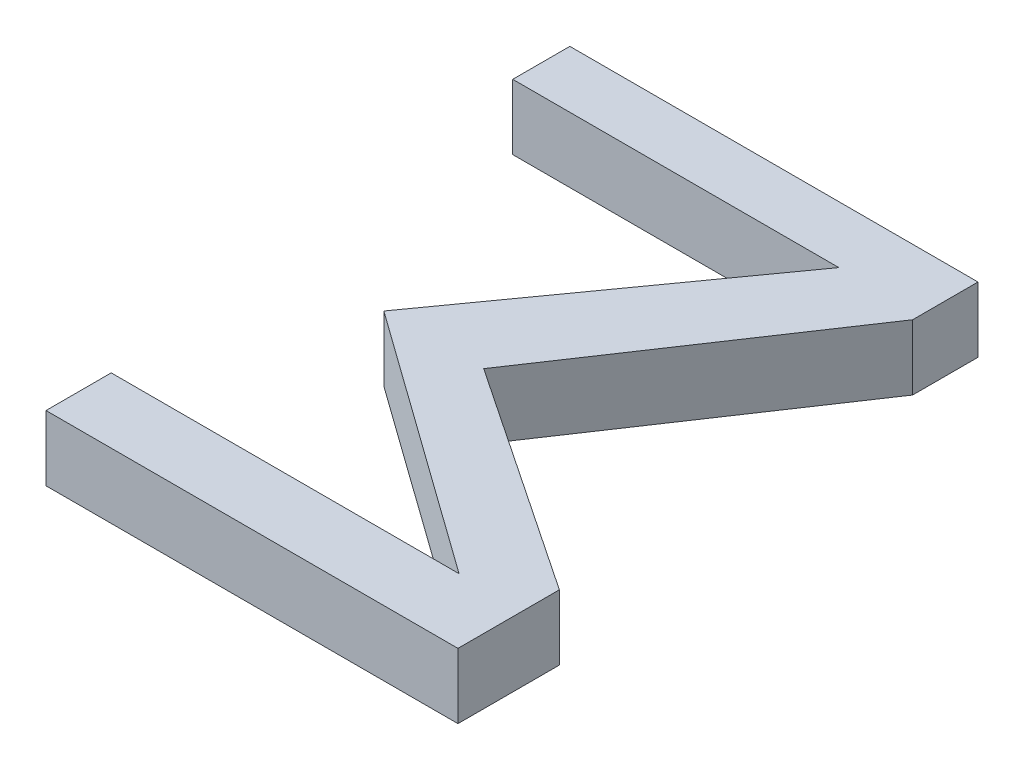
ISO-10303-21;
HEADER;
FILE_DESCRIPTION(('STEP AP214'),'2;1');
FILE_NAME('part.step','',(''),(''),'','','');
FILE_SCHEMA(('AUTOMOTIVE_DESIGN { 1 0 10303 214 1 1 1 1 }'));
ENDSEC;
DATA;
#1=APPLICATION_CONTEXT('core data for automotive mechanical design processes');
#2=APPLICATION_PROTOCOL_DEFINITION('international standard','automotive_design',2000,#1);
#3=PRODUCT_CONTEXT('',#1,'mechanical');
#4=PRODUCT('Part','Part','',(#3));
#5=PRODUCT_RELATED_PRODUCT_CATEGORY('part','',(#4));
#6=PRODUCT_DEFINITION_FORMATION('','',#4);
#7=PRODUCT_DEFINITION_CONTEXT('part definition',#1,'design');
#8=PRODUCT_DEFINITION('design','',#6,#7);
#9=PRODUCT_DEFINITION_SHAPE('','',#8);
#10=(LENGTH_UNIT() NAMED_UNIT(*) SI_UNIT(.MILLI.,.METRE.));
#11=(NAMED_UNIT(*) PLANE_ANGLE_UNIT() SI_UNIT($,.RADIAN.));
#12=(NAMED_UNIT(*) SI_UNIT($,.STERADIAN.) SOLID_ANGLE_UNIT());
#13=UNCERTAINTY_MEASURE_WITH_UNIT(LENGTH_MEASURE(1.E-05),#10,'distance_accuracy_value','');
#14=(GEOMETRIC_REPRESENTATION_CONTEXT(3) GLOBAL_UNCERTAINTY_ASSIGNED_CONTEXT((#13)) GLOBAL_UNIT_ASSIGNED_CONTEXT((#10,
#11,#12)) REPRESENTATION_CONTEXT('',''));
#15=CARTESIAN_POINT('',(0.,0.,0.));
#16=DIRECTION('',(0.,0.,1.));
#17=DIRECTION('',(1.,0.,0.));
#18=AXIS2_PLACEMENT_3D('',#15,#16,#17);
#19=CARTESIAN_POINT('',(-6.26490923773484,3.,-14.8205741626794));
#20=DIRECTION('',(1.,0.,0.));
#21=DIRECTION('',(0.,0.,-1.));
#22=AXIS2_PLACEMENT_3D('',#19,#20,#21);
#23=PLANE('',#22);
#24=DIRECTION('',(0.,0.,1.));
#25=VECTOR('',#24,1.);
#26=CARTESIAN_POINT('',(-6.26490923773484,0.,-14.8205741626794));
#27=LINE('',#26,#25);
#28=CARTESIAN_POINT('',(-6.26490923773484,0.,-14.8205741626794));
#29=VERTEX_POINT('',#28);
#30=CARTESIAN_POINT('',(-6.26490923773484,0.,-12.1941867041222));
#31=VERTEX_POINT('',#30);
#32=EDGE_CURVE('E168',#29,#31,#27,.T.);
#33=ORIENTED_EDGE('',*,*,#32,.T.);
#34=DIRECTION('',(0.,-1.,0.));
#35=VECTOR('',#34,1.);
#36=CARTESIAN_POINT('',(-6.26490923773484,3.,-12.1941867041222));
#37=LINE('',#36,#35);
#38=CARTESIAN_POINT('',(-6.26490923773484,3.,-12.1941867041222));
#39=VERTEX_POINT('',#38);
#40=EDGE_CURVE('E11',#39,#31,#37,.T.);
#41=ORIENTED_EDGE('',*,*,#40,.F.);
#42=DIRECTION('',(0.,0.,1.));
#43=VECTOR('',#42,1.);
#44=CARTESIAN_POINT('',(-6.26490923773484,3.,-14.8205741626794));
#45=LINE('',#44,#43);
#46=CARTESIAN_POINT('',(-6.26490923773484,3.,-14.8205741626794));
#47=VERTEX_POINT('',#46);
#48=EDGE_CURVE('E202',#47,#39,#45,.T.);
#49=ORIENTED_EDGE('',*,*,#48,.F.);
#50=DIRECTION('',(0.,-1.,0.));
#51=VECTOR('',#50,1.);
#52=CARTESIAN_POINT('',(-6.26490923773484,3.,-14.8205741626794));
#53=LINE('',#52,#51);
#54=EDGE_CURVE('E164',#47,#29,#53,.T.);
#55=ORIENTED_EDGE('',*,*,#54,.T.);
#56=EDGE_LOOP('',(#33,#41,#49,#55));
#57=FACE_BOUND('',#56,.T.);
#58=ADVANCED_FACE('F43',(#57),#23,.F.);
#59=CARTESIAN_POINT('',(-6.26490923773484,3.,-12.1941867041222));
#60=DIRECTION('',(0.,0.,-1.));
#61=DIRECTION('',(-1.,0.,0.));
#62=AXIS2_PLACEMENT_3D('',#59,#60,#61);
#63=PLANE('',#62);
#64=DIRECTION('',(1.,0.,0.));
#65=VECTOR('',#64,1.);
#66=CARTESIAN_POINT('',(-6.26490923773484,0.,-12.1941867041222));
#67=LINE('',#66,#65);
#68=CARTESIAN_POINT('',(8.73509076226516,0.,-12.1941867041222));
#69=VERTEX_POINT('',#68);
#70=EDGE_CURVE('E172',#31,#69,#67,.T.);
#71=ORIENTED_EDGE('',*,*,#70,.T.);
#72=DIRECTION('',(0.,-1.,0.));
#73=VECTOR('',#72,1.);
#74=CARTESIAN_POINT('',(8.73509076226516,3.,-12.1941867041222));
#75=LINE('',#74,#73);
#76=CARTESIAN_POINT('',(8.73509076226516,3.,-12.1941867041222));
#77=VERTEX_POINT('',#76);
#78=EDGE_CURVE('E52',#77,#69,#75,.T.);
#79=ORIENTED_EDGE('',*,*,#78,.F.);
#80=DIRECTION('',(1.,0.,0.));
#81=VECTOR('',#80,1.);
#82=CARTESIAN_POINT('',(-6.26490923773484,3.,-12.1941867041222));
#83=LINE('',#82,#81);
#84=EDGE_CURVE('E115',#39,#77,#83,.T.);
#85=ORIENTED_EDGE('',*,*,#84,.F.);
#86=ORIENTED_EDGE('',*,*,#40,.T.);
#87=EDGE_LOOP('',(#71,#79,#85,#86));
#88=FACE_BOUND('',#87,.T.);
#89=ADVANCED_FACE('F296',(#88),#63,.F.);
#90=CARTESIAN_POINT('',(8.73509076226516,3.,-12.1941867041222));
#91=DIRECTION('',(0.812945780274811,0.,0.58233938415101));
#92=DIRECTION('',(0.58233938415101,0.,-0.812945780274811));
#93=AXIS2_PLACEMENT_3D('',#90,#91,#92);
#94=PLANE('',#93);
#95=DIRECTION('',(-0.58233938415101,0.,0.812945780274811));
#96=VECTOR('',#95,1.);
#97=CARTESIAN_POINT('',(8.73509076226516,0.,-12.1941867041222));
#98=LINE('',#97,#96);
#99=CARTESIAN_POINT('',(0.,0.,0.));
#100=VERTEX_POINT('',#99);
#101=EDGE_CURVE('E175',#69,#100,#98,.T.);
#102=ORIENTED_EDGE('',*,*,#101,.T.);
#103=DIRECTION('',(0.,-1.,0.));
#104=VECTOR('',#103,1.);
#105=CARTESIAN_POINT('',(0.,3.,0.));
#106=LINE('',#105,#104);
#107=CARTESIAN_POINT('',(0.,3.,0.));
#108=VERTEX_POINT('',#107);
#109=EDGE_CURVE('E229',#108,#100,#106,.T.);
#110=ORIENTED_EDGE('',*,*,#109,.F.);
#111=DIRECTION('',(-0.58233938415101,0.,0.812945780274811));
#112=VECTOR('',#111,1.);
#113=CARTESIAN_POINT('',(8.73509076226516,3.,-12.1941867041222));
#114=LINE('',#113,#112);
#115=EDGE_CURVE('E239',#77,#108,#114,.T.);
#116=ORIENTED_EDGE('',*,*,#115,.F.);
#117=ORIENTED_EDGE('',*,*,#78,.T.);
#118=EDGE_LOOP('',(#102,#110,#116,#117));
#119=FACE_BOUND('',#118,.T.);
#120=ADVANCED_FACE('F237',(#119),#94,.F.);
#121=CARTESIAN_POINT('',(0.,3.,0.));
#122=DIRECTION('',(0.58233938415101,0.,-0.812945780274812));
#123=DIRECTION('',(-0.812945780274812,0.,-0.58233938415101));
#124=AXIS2_PLACEMENT_3D('',#121,#122,#123);
#125=PLANE('',#124);
#126=DIRECTION('',(0.812945780274811,0.,0.58233938415101));
#127=VECTOR('',#126,1.);
#128=CARTESIAN_POINT('',(0.,0.,0.));
#129=LINE('',#128,#127);
#130=CARTESIAN_POINT('',(12.1941867041222,0.,8.73509076226515));
#131=VERTEX_POINT('',#130);
#132=EDGE_CURVE('E178',#100,#131,#129,.T.);
#133=ORIENTED_EDGE('',*,*,#132,.T.);
#134=DIRECTION('',(0.,-1.,0.));
#135=VECTOR('',#134,1.);
#136=CARTESIAN_POINT('',(12.1941867041222,3.,8.73509076226515));
#137=LINE('',#136,#135);
#138=CARTESIAN_POINT('',(12.1941867041222,3.,8.73509076226515));
#139=VERTEX_POINT('',#138);
#140=EDGE_CURVE('E225',#139,#131,#137,.T.);
#141=ORIENTED_EDGE('',*,*,#140,.F.);
#142=DIRECTION('',(0.812945780274811,0.,0.58233938415101));
#143=VECTOR('',#142,1.);
#144=CARTESIAN_POINT('',(0.,3.,0.));
#145=LINE('',#144,#143);
#146=EDGE_CURVE('E258',#108,#139,#145,.T.);
#147=ORIENTED_EDGE('',*,*,#146,.F.);
#148=ORIENTED_EDGE('',*,*,#109,.T.);
#149=EDGE_LOOP('',(#133,#141,#147,#148));
#150=FACE_BOUND('',#149,.T.);
#151=ADVANCED_FACE('F248',(#150),#125,.F.);
#152=CARTESIAN_POINT('',(12.1941867041222,3.,8.73509076226515));
#153=DIRECTION('',(0.,0.,1.));
#154=DIRECTION('',(1.,0.,0.));
#155=AXIS2_PLACEMENT_3D('',#152,#153,#154);
#156=PLANE('',#155);
#157=DIRECTION('',(-1.,0.,0.));
#158=VECTOR('',#157,1.);
#159=CARTESIAN_POINT('',(12.1941867041222,0.,8.73509076226515));
#160=LINE('',#159,#158);
#161=CARTESIAN_POINT('',(-3.80581329587783,0.,8.73509076226515));
#162=VERTEX_POINT('',#161);
#163=EDGE_CURVE('E181',#131,#162,#160,.T.);
#164=ORIENTED_EDGE('',*,*,#163,.T.);
#165=DIRECTION('',(0.,-1.,0.));
#166=VECTOR('',#165,1.);
#167=CARTESIAN_POINT('',(-3.80581329587783,3.,8.73509076226515));
#168=LINE('',#167,#166);
#169=CARTESIAN_POINT('',(-3.80581329587783,3.,8.73509076226515));
#170=VERTEX_POINT('',#169);
#171=EDGE_CURVE('E221',#170,#162,#168,.T.);
#172=ORIENTED_EDGE('',*,*,#171,.F.);
#173=DIRECTION('',(-1.,0.,0.));
#174=VECTOR('',#173,1.);
#175=CARTESIAN_POINT('',(12.1941867041222,3.,8.73509076226515));
#176=LINE('',#175,#174);
#177=EDGE_CURVE('E254',#139,#170,#176,.T.);
#178=ORIENTED_EDGE('',*,*,#177,.F.);
#179=ORIENTED_EDGE('',*,*,#140,.T.);
#180=EDGE_LOOP('',(#164,#172,#178,#179));
#181=FACE_BOUND('',#180,.T.);
#182=ADVANCED_FACE('F252',(#181),#156,.F.);
#183=CARTESIAN_POINT('',(-3.80581329587783,3.,8.73509076226515));
#184=DIRECTION('',(1.,0.,0.));
#185=DIRECTION('',(0.,0.,-1.));
#186=AXIS2_PLACEMENT_3D('',#183,#184,#185);
#187=PLANE('',#186);
#188=DIRECTION('',(0.,0.,1.));
#189=VECTOR('',#188,1.);
#190=CARTESIAN_POINT('',(-3.80581329587783,0.,8.73509076226515));
#191=LINE('',#190,#189);
#192=CARTESIAN_POINT('',(-3.80581329587783,0.,11.7350907622652));
#193=VERTEX_POINT('',#192);
#194=EDGE_CURVE('E184',#162,#193,#191,.T.);
#195=ORIENTED_EDGE('',*,*,#194,.T.);
#196=DIRECTION('',(0.,-1.,0.));
#197=VECTOR('',#196,1.);
#198=CARTESIAN_POINT('',(-3.80581329587783,3.,11.7350907622652));
#199=LINE('',#198,#197);
#200=CARTESIAN_POINT('',(-3.80581329587783,3.,11.7350907622652));
#201=VERTEX_POINT('',#200);
#202=EDGE_CURVE('E217',#201,#193,#199,.T.);
#203=ORIENTED_EDGE('',*,*,#202,.F.);
#204=DIRECTION('',(0.,0.,1.));
#205=VECTOR('',#204,1.);
#206=CARTESIAN_POINT('',(-3.80581329587783,3.,8.73509076226515));
#207=LINE('',#206,#205);
#208=EDGE_CURVE('E257',#170,#201,#207,.T.);
#209=ORIENTED_EDGE('',*,*,#208,.F.);
#210=ORIENTED_EDGE('',*,*,#171,.T.);
#211=EDGE_LOOP('',(#195,#203,#209,#210));
#212=FACE_BOUND('',#211,.T.);
#213=ADVANCED_FACE('F309',(#212),#187,.F.);
#214=CARTESIAN_POINT('',(-3.80581329587783,3.,11.7350907622652));
#215=DIRECTION('',(0.,0.,-1.));
#216=DIRECTION('',(-1.,0.,0.));
#217=AXIS2_PLACEMENT_3D('',#214,#215,#216);
#218=PLANE('',#217);
#219=DIRECTION('',(1.,0.,0.));
#220=VECTOR('',#219,1.);
#221=CARTESIAN_POINT('',(-3.80581329587783,0.,11.7350907622652));
#222=LINE('',#221,#220);
#223=CARTESIAN_POINT('',(15.1435406698565,0.,11.7350907622652));
#224=VERTEX_POINT('',#223);
#225=EDGE_CURVE('E187',#193,#224,#222,.T.);
#226=ORIENTED_EDGE('',*,*,#225,.T.);
#227=DIRECTION('',(0.,-1.,0.));
#228=VECTOR('',#227,1.);
#229=CARTESIAN_POINT('',(15.1435406698565,3.,11.7350907622652));
#230=LINE('',#229,#228);
#231=CARTESIAN_POINT('',(15.1435406698565,3.,11.7350907622652));
#232=VERTEX_POINT('',#231);
#233=EDGE_CURVE('E213',#232,#224,#230,.T.);
#234=ORIENTED_EDGE('',*,*,#233,.F.);
#235=DIRECTION('',(1.,0.,0.));
#236=VECTOR('',#235,1.);
#237=CARTESIAN_POINT('',(-3.80581329587783,3.,11.7350907622652));
#238=LINE('',#237,#236);
#239=EDGE_CURVE('E262',#201,#232,#238,.T.);
#240=ORIENTED_EDGE('',*,*,#239,.F.);
#241=ORIENTED_EDGE('',*,*,#202,.T.);
#242=EDGE_LOOP('',(#226,#234,#240,#241));
#243=FACE_BOUND('',#242,.T.);
#244=ADVANCED_FACE('F312',(#243),#218,.F.);
#245=CARTESIAN_POINT('',(15.1435406698565,3.,11.7350907622652));
#246=DIRECTION('',(-1.,0.,0.));
#247=DIRECTION('',(0.,0.,1.));
#248=AXIS2_PLACEMENT_3D('',#245,#246,#247);
#249=PLANE('',#248);
#250=DIRECTION('',(0.,0.,-1.));
#251=VECTOR('',#250,1.);
#252=CARTESIAN_POINT('',(15.1435406698565,0.,11.7350907622652));
#253=LINE('',#252,#251);
#254=CARTESIAN_POINT('',(15.1435406698565,0.,7.07001899193023));
#255=VERTEX_POINT('',#254);
#256=EDGE_CURVE('E190',#224,#255,#253,.T.);
#257=ORIENTED_EDGE('',*,*,#256,.T.);
#258=DIRECTION('',(0.,-1.,0.));
#259=VECTOR('',#258,1.);
#260=CARTESIAN_POINT('',(15.1435406698565,3.,7.07001899193023));
#261=LINE('',#260,#259);
#262=CARTESIAN_POINT('',(15.1435406698565,3.,7.07001899193023));
#263=VERTEX_POINT('',#262);
#264=EDGE_CURVE('E209',#263,#255,#261,.T.);
#265=ORIENTED_EDGE('',*,*,#264,.F.);
#266=DIRECTION('',(0.,0.,-1.));
#267=VECTOR('',#266,1.);
#268=CARTESIAN_POINT('',(15.1435406698565,3.,11.7350907622652));
#269=LINE('',#268,#267);
#270=EDGE_CURVE('E269',#232,#263,#269,.T.);
#271=ORIENTED_EDGE('',*,*,#270,.F.);
#272=ORIENTED_EDGE('',*,*,#233,.T.);
#273=EDGE_LOOP('',(#257,#265,#271,#272));
#274=FACE_BOUND('',#273,.T.);
#275=ADVANCED_FACE('F277',(#274),#249,.F.);
#276=CARTESIAN_POINT('',(15.1435406698565,3.,7.07001899193023));
#277=DIRECTION('',(-0.556689720941758,0.,0.830720503296859));
#278=DIRECTION('',(0.830720503296859,0.,0.556689720941759));
#279=AXIS2_PLACEMENT_3D('',#276,#277,#278);
#280=PLANE('',#279);
#281=DIRECTION('',(-0.830720503296859,0.,-0.556689720941758));
#282=VECTOR('',#281,1.);
#283=CARTESIAN_POINT('',(15.1435406698565,0.,7.07001899193023));
#284=LINE('',#283,#282);
#285=CARTESIAN_POINT('',(4.5933014354067,0.,0.));
#286=VERTEX_POINT('',#285);
#287=EDGE_CURVE('E193',#255,#286,#284,.T.);
#288=ORIENTED_EDGE('',*,*,#287,.T.);
#289=DIRECTION('',(0.,-1.,0.));
#290=VECTOR('',#289,1.);
#291=CARTESIAN_POINT('',(4.5933014354067,3.,0.));
#292=LINE('',#291,#290);
#293=CARTESIAN_POINT('',(4.5933014354067,3.,0.));
#294=VERTEX_POINT('',#293);
#295=EDGE_CURVE('E157',#294,#286,#292,.T.);
#296=ORIENTED_EDGE('',*,*,#295,.F.);
#297=DIRECTION('',(-0.830720503296859,0.,-0.556689720941758));
#298=VECTOR('',#297,1.);
#299=CARTESIAN_POINT('',(15.1435406698565,3.,7.07001899193023));
#300=LINE('',#299,#298);
#301=EDGE_CURVE('E146',#263,#294,#300,.T.);
#302=ORIENTED_EDGE('',*,*,#301,.F.);
#303=ORIENTED_EDGE('',*,*,#264,.T.);
#304=EDGE_LOOP('',(#288,#296,#302,#303));
#305=FACE_BOUND('',#304,.T.);
#306=ADVANCED_FACE('F281',(#305),#280,.F.);
#307=CARTESIAN_POINT('',(4.5933014354067,3.,0.));
#308=DIRECTION('',(-0.830720503296859,0.,-0.556689720941758));
#309=DIRECTION('',(-0.556689720941759,0.,0.830720503296859));
#310=AXIS2_PLACEMENT_3D('',#307,#308,#309);
#311=PLANE('',#310);
#312=DIRECTION('',(0.556689720941758,0.,-0.830720503296859));
#313=VECTOR('',#312,1.);
#314=CARTESIAN_POINT('',(4.5933014354067,0.,0.));
#315=LINE('',#314,#313);
#316=CARTESIAN_POINT('',(12.5103400031404,0.,-11.8142046030278));
#317=VERTEX_POINT('',#316);
#318=EDGE_CURVE('E155',#286,#317,#315,.T.);
#319=ORIENTED_EDGE('',*,*,#318,.T.);
#320=DIRECTION('',(0.,-1.,0.));
#321=VECTOR('',#320,1.);
#322=CARTESIAN_POINT('',(12.5103400031404,3.,-11.8142046030278));
#323=LINE('',#322,#321);
#324=CARTESIAN_POINT('',(12.5103400031404,3.,-11.8142046030278));
#325=VERTEX_POINT('',#324);
#326=EDGE_CURVE('E152',#325,#317,#323,.T.);
#327=ORIENTED_EDGE('',*,*,#326,.F.);
#328=DIRECTION('',(0.556689720941758,0.,-0.830720503296859));
#329=VECTOR('',#328,1.);
#330=CARTESIAN_POINT('',(4.5933014354067,3.,0.));
#331=LINE('',#330,#329);
#332=EDGE_CURVE('E140',#294,#325,#331,.T.);
#333=ORIENTED_EDGE('',*,*,#332,.F.);
#334=ORIENTED_EDGE('',*,*,#295,.T.);
#335=EDGE_LOOP('',(#319,#327,#333,#334));
#336=FACE_BOUND('',#335,.T.);
#337=ADVANCED_FACE('F153',(#336),#311,.F.);
#338=CARTESIAN_POINT('',(12.5103400031404,3.,-11.8142046030278));
#339=DIRECTION('',(-1.,0.,0.));
#340=DIRECTION('',(0.,0.,1.));
#341=AXIS2_PLACEMENT_3D('',#338,#339,#340);
#342=PLANE('',#341);
#343=DIRECTION('',(0.,0.,-1.));
#344=VECTOR('',#343,1.);
#345=CARTESIAN_POINT('',(12.5103400031404,0.,-11.8142046030278));
#346=LINE('',#345,#344);
#347=CARTESIAN_POINT('',(12.5103400031404,0.,-14.8205741626794));
#348=VERTEX_POINT('',#347);
#349=EDGE_CURVE('E101',#317,#348,#346,.T.);
#350=ORIENTED_EDGE('',*,*,#349,.T.);
#351=DIRECTION('',(0.,-1.,0.));
#352=VECTOR('',#351,1.);
#353=CARTESIAN_POINT('',(12.5103400031404,3.,-14.8205741626794));
#354=LINE('',#353,#352);
#355=CARTESIAN_POINT('',(12.5103400031404,3.,-14.8205741626794));
#356=VERTEX_POINT('',#355);
#357=EDGE_CURVE('E158',#356,#348,#354,.T.);
#358=ORIENTED_EDGE('',*,*,#357,.F.);
#359=DIRECTION('',(0.,0.,-1.));
#360=VECTOR('',#359,1.);
#361=CARTESIAN_POINT('',(12.5103400031404,3.,-11.8142046030278));
#362=LINE('',#361,#360);
#363=EDGE_CURVE('E144',#325,#356,#362,.T.);
#364=ORIENTED_EDGE('',*,*,#363,.F.);
#365=ORIENTED_EDGE('',*,*,#326,.T.);
#366=EDGE_LOOP('',(#350,#358,#364,#365));
#367=FACE_BOUND('',#366,.T.);
#368=ADVANCED_FACE('F160',(#367),#342,.F.);
#369=CARTESIAN_POINT('',(12.5103400031404,3.,-14.8205741626794));
#370=DIRECTION('',(0.,0.,1.));
#371=DIRECTION('',(1.,0.,0.));
#372=AXIS2_PLACEMENT_3D('',#369,#370,#371);
#373=PLANE('',#372);
#374=DIRECTION('',(-1.,0.,0.));
#375=VECTOR('',#374,1.);
#376=CARTESIAN_POINT('',(12.5103400031404,0.,-14.8205741626794));
#377=LINE('',#376,#375);
#378=EDGE_CURVE('E107',#348,#29,#377,.T.);
#379=ORIENTED_EDGE('',*,*,#378,.T.);
#380=ORIENTED_EDGE('',*,*,#54,.F.);
#381=DIRECTION('',(-1.,0.,0.));
#382=VECTOR('',#381,1.);
#383=CARTESIAN_POINT('',(12.5103400031404,3.,-14.8205741626794));
#384=LINE('',#383,#382);
#385=EDGE_CURVE('E60',#356,#47,#384,.T.);
#386=ORIENTED_EDGE('',*,*,#385,.F.);
#387=ORIENTED_EDGE('',*,*,#357,.T.);
#388=EDGE_LOOP('',(#379,#380,#386,#387));
#389=FACE_BOUND('',#388,.T.);
#390=ADVANCED_FACE('F285',(#389),#373,.F.);
#391=CARTESIAN_POINT('',(0.,3.,0.));
#392=DIRECTION('',(0.,1.,0.));
#393=DIRECTION('',(0.,0.,1.));
#394=AXIS2_PLACEMENT_3D('',#391,#392,#393);
#395=PLANE('',#394);
#396=ORIENTED_EDGE('',*,*,#48,.T.);
#397=ORIENTED_EDGE('',*,*,#84,.T.);
#398=ORIENTED_EDGE('',*,*,#115,.T.);
#399=ORIENTED_EDGE('',*,*,#146,.T.);
#400=ORIENTED_EDGE('',*,*,#177,.T.);
#401=ORIENTED_EDGE('',*,*,#208,.T.);
#402=ORIENTED_EDGE('',*,*,#239,.T.);
#403=ORIENTED_EDGE('',*,*,#270,.T.);
#404=ORIENTED_EDGE('',*,*,#301,.T.);
#405=ORIENTED_EDGE('',*,*,#332,.T.);
#406=ORIENTED_EDGE('',*,*,#363,.T.);
#407=ORIENTED_EDGE('',*,*,#385,.T.);
#408=EDGE_LOOP('',(#396,#397,#398,#399,#400,#401,#402,#403,#404,#405,#406,#407));
#409=FACE_BOUND('',#408,.T.);
#410=ADVANCED_FACE('F142',(#409),#395,.T.);
#411=CARTESIAN_POINT('',(0.,0.,0.));
#412=DIRECTION('',(0.,1.,0.));
#413=DIRECTION('',(0.,0.,1.));
#414=AXIS2_PLACEMENT_3D('',#411,#412,#413);
#415=PLANE('',#414);
#416=ORIENTED_EDGE('',*,*,#32,.F.);
#417=ORIENTED_EDGE('',*,*,#378,.F.);
#418=ORIENTED_EDGE('',*,*,#349,.F.);
#419=ORIENTED_EDGE('',*,*,#318,.F.);
#420=ORIENTED_EDGE('',*,*,#287,.F.);
#421=ORIENTED_EDGE('',*,*,#256,.F.);
#422=ORIENTED_EDGE('',*,*,#225,.F.);
#423=ORIENTED_EDGE('',*,*,#194,.F.);
#424=ORIENTED_EDGE('',*,*,#163,.F.);
#425=ORIENTED_EDGE('',*,*,#132,.F.);
#426=ORIENTED_EDGE('',*,*,#101,.F.);
#427=ORIENTED_EDGE('',*,*,#70,.F.);
#428=EDGE_LOOP('',(#416,#417,#418,#419,#420,#421,#422,#423,#424,#425,#426,#427));
#429=FACE_BOUND('',#428,.T.);
#430=ADVANCED_FACE('F243',(#429),#415,.F.);
#431=CLOSED_SHELL('',(#58,#89,#120,#151,#182,#213,#244,#275,#306,#337,#368,#390,#410,#430));
#432=MANIFOLD_SOLID_BREP('B2',#431);
#433=ADVANCED_BREP_SHAPE_REPRESENTATION('',(#18,#432),#14);
#434=SHAPE_DEFINITION_REPRESENTATION(#9,#433);
ENDSEC;
END-ISO-10303-21;
